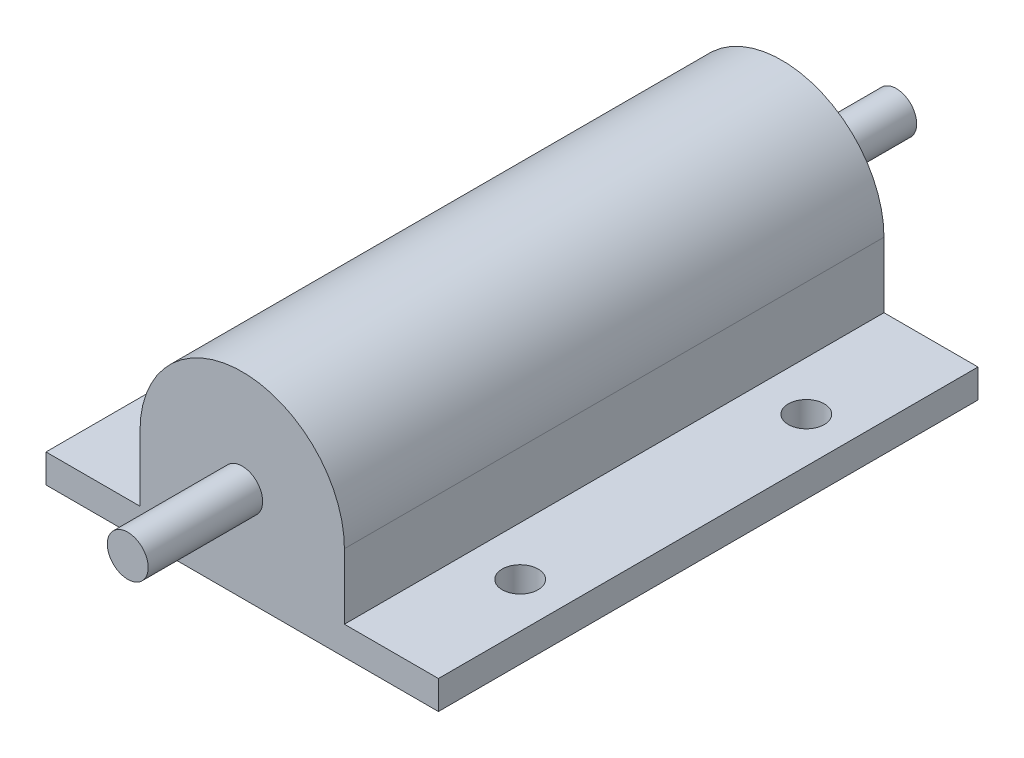
ISO-10303-21;
HEADER;
FILE_DESCRIPTION(('STEP AP214'),'2;1');
FILE_NAME('part.step','',(''),(''),'','','');
FILE_SCHEMA(('AUTOMOTIVE_DESIGN { 1 0 10303 214 1 1 1 1 }'));
ENDSEC;
DATA;
#1=APPLICATION_CONTEXT('core data for automotive mechanical design processes');
#2=APPLICATION_PROTOCOL_DEFINITION('international standard','automotive_design',2000,#1);
#3=PRODUCT_CONTEXT('',#1,'mechanical');
#4=PRODUCT('Part','Part','',(#3));
#5=PRODUCT_RELATED_PRODUCT_CATEGORY('part','',(#4));
#6=PRODUCT_DEFINITION_FORMATION('','',#4);
#7=PRODUCT_DEFINITION_CONTEXT('part definition',#1,'design');
#8=PRODUCT_DEFINITION('design','',#6,#7);
#9=PRODUCT_DEFINITION_SHAPE('','',#8);
#10=(LENGTH_UNIT() NAMED_UNIT(*) SI_UNIT(.MILLI.,.METRE.));
#11=(NAMED_UNIT(*) PLANE_ANGLE_UNIT() SI_UNIT($,.RADIAN.));
#12=(NAMED_UNIT(*) SI_UNIT($,.STERADIAN.) SOLID_ANGLE_UNIT());
#13=UNCERTAINTY_MEASURE_WITH_UNIT(LENGTH_MEASURE(1.E-05),#10,'distance_accuracy_value','');
#14=(GEOMETRIC_REPRESENTATION_CONTEXT(3) GLOBAL_UNCERTAINTY_ASSIGNED_CONTEXT((#13)) GLOBAL_UNIT_ASSIGNED_CONTEXT((#10,
#11,#12)) REPRESENTATION_CONTEXT('',''));
#15=CARTESIAN_POINT('',(0.,0.,0.));
#16=DIRECTION('',(0.,0.,1.));
#17=DIRECTION('',(1.,0.,0.));
#18=AXIS2_PLACEMENT_3D('',#15,#16,#17);
#19=CARTESIAN_POINT('',(-24.,-11.5,33.));
#20=DIRECTION('',(1.,0.,0.));
#21=DIRECTION('',(0.,0.,-1.));
#22=AXIS2_PLACEMENT_3D('',#19,#20,#21);
#23=PLANE('',#22);
#24=DIRECTION('',(0.,-1.,0.));
#25=VECTOR('',#24,1.);
#26=CARTESIAN_POINT('',(-24.,-11.5,-33.));
#27=LINE('',#26,#25);
#28=CARTESIAN_POINT('',(-24.,-8.,-33.));
#29=VERTEX_POINT('',#28);
#30=CARTESIAN_POINT('',(-24.,-11.5,-33.));
#31=VERTEX_POINT('',#30);
#32=EDGE_CURVE('E141',#29,#31,#27,.T.);
#33=ORIENTED_EDGE('',*,*,#32,.T.);
#34=DIRECTION('',(0.,0.,-1.));
#35=VECTOR('',#34,1.);
#36=CARTESIAN_POINT('',(-24.,-11.5,33.));
#37=LINE('',#36,#35);
#38=CARTESIAN_POINT('',(-24.,-11.5,33.));
#39=VERTEX_POINT('',#38);
#40=EDGE_CURVE('E52',#39,#31,#37,.T.);
#41=ORIENTED_EDGE('',*,*,#40,.F.);
#42=DIRECTION('',(0.,-1.,0.));
#43=VECTOR('',#42,1.);
#44=CARTESIAN_POINT('',(-24.,-11.5,33.));
#45=LINE('',#44,#43);
#46=CARTESIAN_POINT('',(-24.,-8.,33.));
#47=VERTEX_POINT('',#46);
#48=EDGE_CURVE('E156',#47,#39,#45,.T.);
#49=ORIENTED_EDGE('',*,*,#48,.F.);
#50=DIRECTION('',(0.,0.,-1.));
#51=VECTOR('',#50,1.);
#52=CARTESIAN_POINT('',(-24.,-8.,33.));
#53=LINE('',#52,#51);
#54=EDGE_CURVE('E137',#47,#29,#53,.T.);
#55=ORIENTED_EDGE('',*,*,#54,.T.);
#56=EDGE_LOOP('',(#33,#41,#49,#55));
#57=FACE_BOUND('',#56,.T.);
#58=ADVANCED_FACE('F44',(#57),#23,.F.);
#59=CARTESIAN_POINT('',(-24.,-11.5,33.));
#60=DIRECTION('',(0.,1.,0.));
#61=DIRECTION('',(0.,0.,1.));
#62=AXIS2_PLACEMENT_3D('',#59,#60,#61);
#63=PLANE('',#62);
#64=CARTESIAN_POINT('',(18.5,-11.5,-17.5));
#65=DIRECTION('',(0.,1.,0.));
#66=DIRECTION('',(0.,0.,1.));
#67=AXIS2_PLACEMENT_3D('',#64,#65,#66);
#68=CIRCLE('',#67,2.2);
#69=CARTESIAN_POINT('',(18.5,-11.5,-15.3));
#70=VERTEX_POINT('',#69);
#71=EDGE_CURVE('E199',#70,#70,#68,.T.);
#72=ORIENTED_EDGE('',*,*,#71,.T.);
#73=EDGE_LOOP('',(#72));
#74=FACE_BOUND('',#73,.T.);
#75=CARTESIAN_POINT('',(18.5,-11.5,17.5));
#76=DIRECTION('',(0.,1.,0.));
#77=DIRECTION('',(0.,0.,1.));
#78=AXIS2_PLACEMENT_3D('',#75,#76,#77);
#79=CIRCLE('',#78,2.2);
#80=CARTESIAN_POINT('',(18.5,-11.5,19.7));
#81=VERTEX_POINT('',#80);
#82=EDGE_CURVE('E206',#81,#81,#79,.T.);
#83=ORIENTED_EDGE('',*,*,#82,.T.);
#84=EDGE_LOOP('',(#83));
#85=FACE_BOUND('',#84,.T.);
#86=CARTESIAN_POINT('',(-18.5,-11.5,17.5));
#87=DIRECTION('',(0.,1.,0.));
#88=DIRECTION('',(0.,0.,1.));
#89=AXIS2_PLACEMENT_3D('',#86,#87,#88);
#90=CIRCLE('',#89,2.2);
#91=CARTESIAN_POINT('',(-18.5,-11.5,19.7));
#92=VERTEX_POINT('',#91);
#93=EDGE_CURVE('E212',#92,#92,#90,.T.);
#94=ORIENTED_EDGE('',*,*,#93,.T.);
#95=EDGE_LOOP('',(#94));
#96=FACE_BOUND('',#95,.T.);
#97=CARTESIAN_POINT('',(-18.5,-11.5,-17.5));
#98=DIRECTION('',(0.,1.,0.));
#99=DIRECTION('',(0.,0.,1.));
#100=AXIS2_PLACEMENT_3D('',#97,#98,#99);
#101=CIRCLE('',#100,2.2);
#102=CARTESIAN_POINT('',(-18.5,-11.5,-15.3));
#103=VERTEX_POINT('',#102);
#104=EDGE_CURVE('E145',#103,#103,#101,.T.);
#105=ORIENTED_EDGE('',*,*,#104,.T.);
#106=EDGE_LOOP('',(#105));
#107=FACE_BOUND('',#106,.T.);
#108=DIRECTION('',(1.,0.,0.));
#109=VECTOR('',#108,1.);
#110=CARTESIAN_POINT('',(-24.,-11.5,-33.));
#111=LINE('',#110,#109);
#112=CARTESIAN_POINT('',(24.,-11.5,-33.));
#113=VERTEX_POINT('',#112);
#114=EDGE_CURVE('E144',#31,#113,#111,.T.);
#115=ORIENTED_EDGE('',*,*,#114,.T.);
#116=DIRECTION('',(0.,0.,-1.));
#117=VECTOR('',#116,1.);
#118=CARTESIAN_POINT('',(24.,-11.5,33.));
#119=LINE('',#118,#117);
#120=CARTESIAN_POINT('',(24.,-11.5,33.));
#121=VERTEX_POINT('',#120);
#122=EDGE_CURVE('E166',#121,#113,#119,.T.);
#123=ORIENTED_EDGE('',*,*,#122,.F.);
#124=DIRECTION('',(1.,0.,0.));
#125=VECTOR('',#124,1.);
#126=CARTESIAN_POINT('',(-24.,-11.5,33.));
#127=LINE('',#126,#125);
#128=EDGE_CURVE('E104',#39,#121,#127,.T.);
#129=ORIENTED_EDGE('',*,*,#128,.F.);
#130=ORIENTED_EDGE('',*,*,#40,.T.);
#131=EDGE_LOOP('',(#115,#123,#129,#130));
#132=FACE_BOUND('',#131,.T.);
#133=ADVANCED_FACE('F169',(#74,#85,#96,#107,#132),#63,.F.);
#134=CARTESIAN_POINT('',(24.,-11.5,33.));
#135=DIRECTION('',(-1.,0.,0.));
#136=DIRECTION('',(0.,0.,1.));
#137=AXIS2_PLACEMENT_3D('',#134,#135,#136);
#138=PLANE('',#137);
#139=DIRECTION('',(0.,1.,0.));
#140=VECTOR('',#139,1.);
#141=CARTESIAN_POINT('',(24.,-11.5,-33.));
#142=LINE('',#141,#140);
#143=CARTESIAN_POINT('',(24.,-8.,-33.));
#144=VERTEX_POINT('',#143);
#145=EDGE_CURVE('E147',#113,#144,#142,.T.);
#146=ORIENTED_EDGE('',*,*,#145,.T.);
#147=DIRECTION('',(0.,0.,-1.));
#148=VECTOR('',#147,1.);
#149=CARTESIAN_POINT('',(24.,-8.,33.));
#150=LINE('',#149,#148);
#151=CARTESIAN_POINT('',(24.,-8.,33.));
#152=VERTEX_POINT('',#151);
#153=EDGE_CURVE('E163',#152,#144,#150,.T.);
#154=ORIENTED_EDGE('',*,*,#153,.F.);
#155=DIRECTION('',(0.,1.,0.));
#156=VECTOR('',#155,1.);
#157=CARTESIAN_POINT('',(24.,-11.5,33.));
#158=LINE('',#157,#156);
#159=EDGE_CURVE('E187',#121,#152,#158,.T.);
#160=ORIENTED_EDGE('',*,*,#159,.F.);
#161=ORIENTED_EDGE('',*,*,#122,.T.);
#162=EDGE_LOOP('',(#146,#154,#160,#161));
#163=FACE_BOUND('',#162,.T.);
#164=ADVANCED_FACE('F180',(#163),#138,.F.);
#165=CARTESIAN_POINT('',(12.5,-8.,33.));
#166=DIRECTION('',(0.,-1.,0.));
#167=DIRECTION('',(0.,0.,-1.));
#168=AXIS2_PLACEMENT_3D('',#165,#166,#167);
#169=PLANE('',#168);
#170=CARTESIAN_POINT('',(18.5,-8.,-17.5));
#171=DIRECTION('',(0.,1.,0.));
#172=DIRECTION('',(0.,0.,1.));
#173=AXIS2_PLACEMENT_3D('',#170,#171,#172);
#174=CIRCLE('',#173,2.2);
#175=CARTESIAN_POINT('',(18.5,-8.,-15.3));
#176=VERTEX_POINT('',#175);
#177=EDGE_CURVE('E202',#176,#176,#174,.T.);
#178=ORIENTED_EDGE('',*,*,#177,.F.);
#179=EDGE_LOOP('',(#178));
#180=FACE_BOUND('',#179,.T.);
#181=CARTESIAN_POINT('',(18.5,-8.,17.5));
#182=DIRECTION('',(0.,1.,0.));
#183=DIRECTION('',(0.,0.,1.));
#184=AXIS2_PLACEMENT_3D('',#181,#182,#183);
#185=CIRCLE('',#184,2.2);
#186=CARTESIAN_POINT('',(18.5,-8.,19.7));
#187=VERTEX_POINT('',#186);
#188=EDGE_CURVE('E209',#187,#187,#185,.T.);
#189=ORIENTED_EDGE('',*,*,#188,.F.);
#190=EDGE_LOOP('',(#189));
#191=FACE_BOUND('',#190,.T.);
#192=DIRECTION('',(-1.,0.,0.));
#193=VECTOR('',#192,1.);
#194=CARTESIAN_POINT('',(12.5,-8.,-33.));
#195=LINE('',#194,#193);
#196=CARTESIAN_POINT('',(12.5,-8.,-33.));
#197=VERTEX_POINT('',#196);
#198=EDGE_CURVE('E149',#144,#197,#195,.T.);
#199=ORIENTED_EDGE('',*,*,#198,.T.);
#200=DIRECTION('',(0.,0.,-1.));
#201=VECTOR('',#200,1.);
#202=CARTESIAN_POINT('',(12.5,-8.,33.));
#203=LINE('',#202,#201);
#204=CARTESIAN_POINT('',(12.5,-8.,33.));
#205=VERTEX_POINT('',#204);
#206=EDGE_CURVE('E160',#205,#197,#203,.T.);
#207=ORIENTED_EDGE('',*,*,#206,.F.);
#208=DIRECTION('',(-1.,0.,0.));
#209=VECTOR('',#208,1.);
#210=CARTESIAN_POINT('',(12.5,-8.,33.));
#211=LINE('',#210,#209);
#212=EDGE_CURVE('E186',#152,#205,#211,.T.);
#213=ORIENTED_EDGE('',*,*,#212,.F.);
#214=ORIENTED_EDGE('',*,*,#153,.T.);
#215=EDGE_LOOP('',(#199,#207,#213,#214));
#216=FACE_BOUND('',#215,.T.);
#217=ADVANCED_FACE('F184',(#180,#191,#216),#169,.F.);
#218=CARTESIAN_POINT('',(12.5,0.,33.));
#219=DIRECTION('',(-1.,0.,0.));
#220=DIRECTION('',(0.,0.,1.));
#221=AXIS2_PLACEMENT_3D('',#218,#219,#220);
#222=PLANE('',#221);
#223=DIRECTION('',(0.,1.,0.));
#224=VECTOR('',#223,1.);
#225=CARTESIAN_POINT('',(12.5,0.,-33.));
#226=LINE('',#225,#224);
#227=CARTESIAN_POINT('',(12.5,0.,-33.));
#228=VERTEX_POINT('',#227);
#229=EDGE_CURVE('E151',#197,#228,#226,.T.);
#230=ORIENTED_EDGE('',*,*,#229,.T.);
#231=DIRECTION('',(0.,0.,-1.));
#232=VECTOR('',#231,1.);
#233=CARTESIAN_POINT('',(12.5,0.,33.));
#234=LINE('',#233,#232);
#235=CARTESIAN_POINT('',(12.5,0.,33.));
#236=VERTEX_POINT('',#235);
#237=EDGE_CURVE('E132',#236,#228,#234,.T.);
#238=ORIENTED_EDGE('',*,*,#237,.F.);
#239=DIRECTION('',(0.,1.,0.));
#240=VECTOR('',#239,1.);
#241=CARTESIAN_POINT('',(12.5,0.,33.));
#242=LINE('',#241,#240);
#243=EDGE_CURVE('E123',#205,#236,#242,.T.);
#244=ORIENTED_EDGE('',*,*,#243,.F.);
#245=ORIENTED_EDGE('',*,*,#206,.T.);
#246=EDGE_LOOP('',(#230,#238,#244,#245));
#247=FACE_BOUND('',#246,.T.);
#248=ADVANCED_FACE('F250',(#247),#222,.F.);
#249=CARTESIAN_POINT('',(0.,0.,33.));
#250=DIRECTION('',(0.,0.,-1.));
#251=DIRECTION('',(-1.,0.,0.));
#252=AXIS2_PLACEMENT_3D('',#249,#250,#251);
#253=CYLINDRICAL_SURFACE('',#252,12.5);
#254=CARTESIAN_POINT('',(0.,0.,-33.));
#255=DIRECTION('',(0.,0.,1.));
#256=DIRECTION('',(1.,0.,0.));
#257=AXIS2_PLACEMENT_3D('',#254,#255,#256);
#258=CIRCLE('',#257,12.5);
#259=CARTESIAN_POINT('',(-12.5,0.,-33.));
#260=VERTEX_POINT('',#259);
#261=EDGE_CURVE('E131',#228,#260,#258,.T.);
#262=ORIENTED_EDGE('',*,*,#261,.T.);
#263=DIRECTION('',(0.,0.,-1.));
#264=VECTOR('',#263,1.);
#265=CARTESIAN_POINT('',(-12.5,0.,33.));
#266=LINE('',#265,#264);
#267=CARTESIAN_POINT('',(-12.5,0.,33.));
#268=VERTEX_POINT('',#267);
#269=EDGE_CURVE('E128',#268,#260,#266,.T.);
#270=ORIENTED_EDGE('',*,*,#269,.F.);
#271=CARTESIAN_POINT('',(0.,0.,33.));
#272=DIRECTION('',(0.,0.,1.));
#273=DIRECTION('',(1.,0.,0.));
#274=AXIS2_PLACEMENT_3D('',#271,#272,#273);
#275=CIRCLE('',#274,12.5);
#276=EDGE_CURVE('E117',#236,#268,#275,.T.);
#277=ORIENTED_EDGE('',*,*,#276,.F.);
#278=ORIENTED_EDGE('',*,*,#237,.T.);
#279=EDGE_LOOP('',(#262,#270,#277,#278));
#280=FACE_BOUND('',#279,.T.);
#281=ADVANCED_FACE('F129',(#280),#253,.T.);
#282=CARTESIAN_POINT('',(-12.5,0.,33.));
#283=DIRECTION('',(1.,0.,0.));
#284=DIRECTION('',(0.,0.,-1.));
#285=AXIS2_PLACEMENT_3D('',#282,#283,#284);
#286=PLANE('',#285);
#287=DIRECTION('',(0.,-1.,0.));
#288=VECTOR('',#287,1.);
#289=CARTESIAN_POINT('',(-12.5,0.,-33.));
#290=LINE('',#289,#288);
#291=CARTESIAN_POINT('',(-12.5,-8.,-33.));
#292=VERTEX_POINT('',#291);
#293=EDGE_CURVE('E89',#260,#292,#290,.T.);
#294=ORIENTED_EDGE('',*,*,#293,.T.);
#295=DIRECTION('',(0.,0.,-1.));
#296=VECTOR('',#295,1.);
#297=CARTESIAN_POINT('',(-12.5,-8.,33.));
#298=LINE('',#297,#296);
#299=CARTESIAN_POINT('',(-12.5,-8.,33.));
#300=VERTEX_POINT('',#299);
#301=EDGE_CURVE('E133',#300,#292,#298,.T.);
#302=ORIENTED_EDGE('',*,*,#301,.F.);
#303=DIRECTION('',(0.,-1.,0.));
#304=VECTOR('',#303,1.);
#305=CARTESIAN_POINT('',(-12.5,0.,33.));
#306=LINE('',#305,#304);
#307=EDGE_CURVE('E121',#268,#300,#306,.T.);
#308=ORIENTED_EDGE('',*,*,#307,.F.);
#309=ORIENTED_EDGE('',*,*,#269,.T.);
#310=EDGE_LOOP('',(#294,#302,#308,#309));
#311=FACE_BOUND('',#310,.T.);
#312=ADVANCED_FACE('F135',(#311),#286,.F.);
#313=CARTESIAN_POINT('',(-24.,-8.,33.));
#314=DIRECTION('',(0.,-1.,0.));
#315=DIRECTION('',(0.,0.,-1.));
#316=AXIS2_PLACEMENT_3D('',#313,#314,#315);
#317=PLANE('',#316);
#318=CARTESIAN_POINT('',(-18.5,-8.,17.5));
#319=DIRECTION('',(0.,1.,0.));
#320=DIRECTION('',(0.,0.,1.));
#321=AXIS2_PLACEMENT_3D('',#318,#319,#320);
#322=CIRCLE('',#321,2.2);
#323=CARTESIAN_POINT('',(-18.5,-8.,19.7));
#324=VERTEX_POINT('',#323);
#325=EDGE_CURVE('E196',#324,#324,#322,.T.);
#326=ORIENTED_EDGE('',*,*,#325,.F.);
#327=EDGE_LOOP('',(#326));
#328=FACE_BOUND('',#327,.T.);
#329=CARTESIAN_POINT('',(-18.5,-8.,-17.5));
#330=DIRECTION('',(0.,1.,0.));
#331=DIRECTION('',(0.,0.,1.));
#332=AXIS2_PLACEMENT_3D('',#329,#330,#331);
#333=CIRCLE('',#332,2.2);
#334=CARTESIAN_POINT('',(-18.5,-8.,-15.3));
#335=VERTEX_POINT('',#334);
#336=EDGE_CURVE('E193',#335,#335,#333,.T.);
#337=ORIENTED_EDGE('',*,*,#336,.F.);
#338=EDGE_LOOP('',(#337));
#339=FACE_BOUND('',#338,.T.);
#340=DIRECTION('',(-1.,0.,0.));
#341=VECTOR('',#340,1.);
#342=CARTESIAN_POINT('',(-24.,-8.,-33.));
#343=LINE('',#342,#341);
#344=EDGE_CURVE('E95',#292,#29,#343,.T.);
#345=ORIENTED_EDGE('',*,*,#344,.T.);
#346=ORIENTED_EDGE('',*,*,#54,.F.);
#347=DIRECTION('',(-1.,0.,0.));
#348=VECTOR('',#347,1.);
#349=CARTESIAN_POINT('',(-24.,-8.,33.));
#350=LINE('',#349,#348);
#351=EDGE_CURVE('E60',#300,#47,#350,.T.);
#352=ORIENTED_EDGE('',*,*,#351,.F.);
#353=ORIENTED_EDGE('',*,*,#301,.T.);
#354=EDGE_LOOP('',(#345,#346,#352,#353));
#355=FACE_BOUND('',#354,.T.);
#356=ADVANCED_FACE('F259',(#328,#339,#355),#317,.F.);
#357=CARTESIAN_POINT('',(0.,0.,33.));
#358=DIRECTION('',(0.,0.,1.));
#359=DIRECTION('',(1.,0.,0.));
#360=AXIS2_PLACEMENT_3D('',#357,#358,#359);
#361=PLANE('',#360);
#362=CARTESIAN_POINT('',(0.,0.,33.));
#363=DIRECTION('',(0.,0.,1.));
#364=DIRECTION('',(1.,0.,0.));
#365=AXIS2_PLACEMENT_3D('',#362,#363,#364);
#366=CIRCLE('',#365,2.5);
#367=CARTESIAN_POINT('',(2.5,0.,33.));
#368=VERTEX_POINT('',#367);
#369=EDGE_CURVE('E219',#368,#368,#366,.T.);
#370=ORIENTED_EDGE('',*,*,#369,.F.);
#371=EDGE_LOOP('',(#370));
#372=FACE_BOUND('',#371,.T.);
#373=ORIENTED_EDGE('',*,*,#48,.T.);
#374=ORIENTED_EDGE('',*,*,#128,.T.);
#375=ORIENTED_EDGE('',*,*,#159,.T.);
#376=ORIENTED_EDGE('',*,*,#212,.T.);
#377=ORIENTED_EDGE('',*,*,#243,.T.);
#378=ORIENTED_EDGE('',*,*,#276,.T.);
#379=ORIENTED_EDGE('',*,*,#307,.T.);
#380=ORIENTED_EDGE('',*,*,#351,.T.);
#381=EDGE_LOOP('',(#373,#374,#375,#376,#377,#378,#379,#380));
#382=FACE_BOUND('',#381,.T.);
#383=ADVANCED_FACE('F119',(#372,#382),#361,.T.);
#384=CARTESIAN_POINT('',(0.,0.,-33.));
#385=DIRECTION('',(0.,0.,1.));
#386=DIRECTION('',(1.,0.,0.));
#387=AXIS2_PLACEMENT_3D('',#384,#385,#386);
#388=PLANE('',#387);
#389=CARTESIAN_POINT('',(0.,0.,-33.));
#390=DIRECTION('',(0.,0.,1.));
#391=DIRECTION('',(1.,0.,0.));
#392=AXIS2_PLACEMENT_3D('',#389,#390,#391);
#393=CIRCLE('',#392,2.5);
#394=CARTESIAN_POINT('',(2.5,0.,-33.));
#395=VERTEX_POINT('',#394);
#396=EDGE_CURVE('E12',#395,#395,#393,.F.);
#397=ORIENTED_EDGE('',*,*,#396,.F.);
#398=EDGE_LOOP('',(#397));
#399=FACE_BOUND('',#398,.T.);
#400=ORIENTED_EDGE('',*,*,#32,.F.);
#401=ORIENTED_EDGE('',*,*,#344,.F.);
#402=ORIENTED_EDGE('',*,*,#293,.F.);
#403=ORIENTED_EDGE('',*,*,#261,.F.);
#404=ORIENTED_EDGE('',*,*,#229,.F.);
#405=ORIENTED_EDGE('',*,*,#198,.F.);
#406=ORIENTED_EDGE('',*,*,#145,.F.);
#407=ORIENTED_EDGE('',*,*,#114,.F.);
#408=EDGE_LOOP('',(#400,#401,#402,#403,#404,#405,#406,#407));
#409=FACE_BOUND('',#408,.T.);
#410=ADVANCED_FACE('F174',(#399,#409),#388,.F.);
#411=CARTESIAN_POINT('',(-18.5,-11.5,-17.5));
#412=DIRECTION('',(0.,1.,0.));
#413=DIRECTION('',(0.,0.,1.));
#414=AXIS2_PLACEMENT_3D('',#411,#412,#413);
#415=CYLINDRICAL_SURFACE('',#414,2.2);
#416=CARTESIAN_POINT('',(-18.5,-11.5,-15.3));
#417=CARTESIAN_POINT('',(-18.5,-11.4635416666667,-15.3));
#418=CARTESIAN_POINT('',(-18.5,-11.4270833333333,-15.3));
#419=CARTESIAN_POINT('',(-18.5,-11.3541666666667,-15.3));
#420=CARTESIAN_POINT('',(-18.5,-11.3177083333333,-15.3));
#421=CARTESIAN_POINT('',(-18.5,-11.2447916666667,-15.3));
#422=CARTESIAN_POINT('',(-18.5,-11.2083333333333,-15.3));
#423=CARTESIAN_POINT('',(-18.5,-11.1354166666667,-15.3));
#424=CARTESIAN_POINT('',(-18.5,-11.0989583333333,-15.3));
#425=CARTESIAN_POINT('',(-18.5,-11.0260416666667,-15.3));
#426=CARTESIAN_POINT('',(-18.5,-10.9895833333333,-15.3));
#427=CARTESIAN_POINT('',(-18.5,-10.9166666666667,-15.3));
#428=CARTESIAN_POINT('',(-18.5,-10.8802083333333,-15.3));
#429=CARTESIAN_POINT('',(-18.5,-10.8072916666667,-15.3));
#430=CARTESIAN_POINT('',(-18.5,-10.7708333333333,-15.3));
#431=CARTESIAN_POINT('',(-18.5,-10.6979166666667,-15.3));
#432=CARTESIAN_POINT('',(-18.5,-10.6614583333333,-15.3));
#433=CARTESIAN_POINT('',(-18.5,-10.5885416666667,-15.3));
#434=CARTESIAN_POINT('',(-18.5,-10.5520833333333,-15.3));
#435=CARTESIAN_POINT('',(-18.5,-10.4791666666667,-15.3));
#436=CARTESIAN_POINT('',(-18.5,-10.4427083333333,-15.3));
#437=CARTESIAN_POINT('',(-18.5,-10.3697916666667,-15.3));
#438=CARTESIAN_POINT('',(-18.5,-10.3333333333333,-15.3));
#439=CARTESIAN_POINT('',(-18.5,-10.2604166666667,-15.3));
#440=CARTESIAN_POINT('',(-18.5,-10.2239583333333,-15.3));
#441=CARTESIAN_POINT('',(-18.5,-10.1510416666667,-15.3));
#442=CARTESIAN_POINT('',(-18.5,-10.1145833333333,-15.3));
#443=CARTESIAN_POINT('',(-18.5,-10.0416666666667,-15.3));
#444=CARTESIAN_POINT('',(-18.5,-10.0052083333333,-15.3));
#445=CARTESIAN_POINT('',(-18.5,-9.93229166666667,-15.3));
#446=CARTESIAN_POINT('',(-18.5,-9.89583333333333,-15.3));
#447=CARTESIAN_POINT('',(-18.5,-9.82291666666667,-15.3));
#448=CARTESIAN_POINT('',(-18.5,-9.78645833333333,-15.3));
#449=CARTESIAN_POINT('',(-18.5,-9.71354166666667,-15.3));
#450=CARTESIAN_POINT('',(-18.5,-9.67708333333333,-15.3));
#451=CARTESIAN_POINT('',(-18.5,-9.60416666666667,-15.3));
#452=CARTESIAN_POINT('',(-18.5,-9.56770833333333,-15.3));
#453=CARTESIAN_POINT('',(-18.5,-9.49479166666667,-15.3));
#454=CARTESIAN_POINT('',(-18.5,-9.45833333333333,-15.3));
#455=CARTESIAN_POINT('',(-18.5,-9.38541666666667,-15.3));
#456=CARTESIAN_POINT('',(-18.5,-9.34895833333333,-15.3));
#457=CARTESIAN_POINT('',(-18.5,-9.27604166666667,-15.3));
#458=CARTESIAN_POINT('',(-18.5,-9.23958333333333,-15.3));
#459=CARTESIAN_POINT('',(-18.5,-9.16666666666667,-15.3));
#460=CARTESIAN_POINT('',(-18.5,-9.13020833333333,-15.3));
#461=CARTESIAN_POINT('',(-18.5,-9.05729166666667,-15.3));
#462=CARTESIAN_POINT('',(-18.5,-9.02083333333333,-15.3));
#463=CARTESIAN_POINT('',(-18.5,-8.94791666666667,-15.3));
#464=CARTESIAN_POINT('',(-18.5,-8.91145833333333,-15.3));
#465=CARTESIAN_POINT('',(-18.5,-8.83854166666667,-15.3));
#466=CARTESIAN_POINT('',(-18.5,-8.80208333333333,-15.3));
#467=CARTESIAN_POINT('',(-18.5,-8.72916666666667,-15.3));
#468=CARTESIAN_POINT('',(-18.5,-8.69270833333333,-15.3));
#469=CARTESIAN_POINT('',(-18.5,-8.61979166666667,-15.3));
#470=CARTESIAN_POINT('',(-18.5,-8.58333333333334,-15.3));
#471=CARTESIAN_POINT('',(-18.5,-8.51041666666667,-15.3));
#472=CARTESIAN_POINT('',(-18.5,-8.47395833333334,-15.3));
#473=CARTESIAN_POINT('',(-18.5,-8.40104166666667,-15.3));
#474=CARTESIAN_POINT('',(-18.5,-8.36458333333334,-15.3));
#475=CARTESIAN_POINT('',(-18.5,-8.29166666666667,-15.3));
#476=CARTESIAN_POINT('',(-18.5,-8.25520833333334,-15.3));
#477=CARTESIAN_POINT('',(-18.5,-8.18229166666667,-15.3));
#478=CARTESIAN_POINT('',(-18.5,-8.14583333333333,-15.3));
#479=CARTESIAN_POINT('',(-18.5,-8.07291666666667,-15.3));
#480=CARTESIAN_POINT('',(-18.5,-8.03645833333333,-15.3));
#481=CARTESIAN_POINT('',(-18.5,-8.,-15.3));
#482=B_SPLINE_CURVE_WITH_KNOTS('',3,(#416,#417,#418,#419,#420,#421,#422,#423,#424,#425,#426,
#427,#428,#429,#430,#431,#432,#433,#434,#435,#436,#437,#438,#439,#440,#441,#442,#443,#444,#445,
#446,#447,#448,#449,#450,#451,#452,#453,#454,#455,#456,#457,#458,#459,#460,#461,#462,#463,#464,
#465,#466,#467,#468,#469,#470,#471,#472,#473,#474,#475,#476,#477,#478,#479,#480,#481),
.UNSPECIFIED.,.F.,.F.,(4,2,2,2,2,2,2,2,2,2,2,2,2,2,2,2,2,2,2,2,2,2,2,2,2,2,2,2,2,2,2,2,4),(0.,
0.109374999999998,0.218749999999998,0.328124999999999,0.437499999999999,0.546874999999999,
0.656249999999999,0.765624999999999,0.874999999999999,0.984374999999999,1.09375,1.203125,1.3125,
1.421875,1.53125,1.640625,1.75,1.859375,1.96875,2.078125,2.1875,2.296875,2.40625,2.515625,2.625,
2.734375,2.84375,2.953125,3.0625,3.171875,3.28125,3.390625,3.5),.UNSPECIFIED.);
#483=EDGE_CURVE('BSEAM265',#103,#335,#482,.T.);
#484=ORIENTED_EDGE('',*,*,#104,.F.);
#485=ORIENTED_EDGE('',*,*,#336,.T.);
#486=ORIENTED_EDGE('',*,*,#483,.T.);
#487=ORIENTED_EDGE('',*,*,#483,.F.);
#488=EDGE_LOOP('',(#484,#486,#485,#487));
#489=FACE_BOUND('',#488,.T.);
#490=ADVANCED_FACE('F265',(#489),#415,.F.);
#491=CARTESIAN_POINT('',(-18.5,-11.5,17.5));
#492=DIRECTION('',(0.,1.,0.));
#493=DIRECTION('',(0.,0.,1.));
#494=AXIS2_PLACEMENT_3D('',#491,#492,#493);
#495=CYLINDRICAL_SURFACE('',#494,2.2);
#496=CARTESIAN_POINT('',(-18.5,-11.5,19.7));
#497=CARTESIAN_POINT('',(-18.5,-11.4635416666667,19.7));
#498=CARTESIAN_POINT('',(-18.5,-11.4270833333333,19.7));
#499=CARTESIAN_POINT('',(-18.5,-11.3541666666667,19.7));
#500=CARTESIAN_POINT('',(-18.5,-11.3177083333333,19.7));
#501=CARTESIAN_POINT('',(-18.5,-11.2447916666667,19.7));
#502=CARTESIAN_POINT('',(-18.5,-11.2083333333333,19.7));
#503=CARTESIAN_POINT('',(-18.5,-11.1354166666667,19.7));
#504=CARTESIAN_POINT('',(-18.5,-11.0989583333333,19.7));
#505=CARTESIAN_POINT('',(-18.5,-11.0260416666667,19.7));
#506=CARTESIAN_POINT('',(-18.5,-10.9895833333333,19.7));
#507=CARTESIAN_POINT('',(-18.5,-10.9166666666667,19.7));
#508=CARTESIAN_POINT('',(-18.5,-10.8802083333333,19.7));
#509=CARTESIAN_POINT('',(-18.5,-10.8072916666667,19.7));
#510=CARTESIAN_POINT('',(-18.5,-10.7708333333333,19.7));
#511=CARTESIAN_POINT('',(-18.5,-10.6979166666667,19.7));
#512=CARTESIAN_POINT('',(-18.5,-10.6614583333333,19.7));
#513=CARTESIAN_POINT('',(-18.5,-10.5885416666667,19.7));
#514=CARTESIAN_POINT('',(-18.5,-10.5520833333333,19.7));
#515=CARTESIAN_POINT('',(-18.5,-10.4791666666667,19.7));
#516=CARTESIAN_POINT('',(-18.5,-10.4427083333333,19.7));
#517=CARTESIAN_POINT('',(-18.5,-10.3697916666667,19.7));
#518=CARTESIAN_POINT('',(-18.5,-10.3333333333333,19.7));
#519=CARTESIAN_POINT('',(-18.5,-10.2604166666667,19.7));
#520=CARTESIAN_POINT('',(-18.5,-10.2239583333333,19.7));
#521=CARTESIAN_POINT('',(-18.5,-10.1510416666667,19.7));
#522=CARTESIAN_POINT('',(-18.5,-10.1145833333333,19.7));
#523=CARTESIAN_POINT('',(-18.5,-10.0416666666667,19.7));
#524=CARTESIAN_POINT('',(-18.5,-10.0052083333333,19.7));
#525=CARTESIAN_POINT('',(-18.5,-9.93229166666667,19.7));
#526=CARTESIAN_POINT('',(-18.5,-9.89583333333333,19.7));
#527=CARTESIAN_POINT('',(-18.5,-9.82291666666667,19.7));
#528=CARTESIAN_POINT('',(-18.5,-9.78645833333333,19.7));
#529=CARTESIAN_POINT('',(-18.5,-9.71354166666667,19.7));
#530=CARTESIAN_POINT('',(-18.5,-9.67708333333333,19.7));
#531=CARTESIAN_POINT('',(-18.5,-9.60416666666667,19.7));
#532=CARTESIAN_POINT('',(-18.5,-9.56770833333333,19.7));
#533=CARTESIAN_POINT('',(-18.5,-9.49479166666667,19.7));
#534=CARTESIAN_POINT('',(-18.5,-9.45833333333333,19.7));
#535=CARTESIAN_POINT('',(-18.5,-9.38541666666667,19.7));
#536=CARTESIAN_POINT('',(-18.5,-9.34895833333333,19.7));
#537=CARTESIAN_POINT('',(-18.5,-9.27604166666667,19.7));
#538=CARTESIAN_POINT('',(-18.5,-9.23958333333333,19.7));
#539=CARTESIAN_POINT('',(-18.5,-9.16666666666667,19.7));
#540=CARTESIAN_POINT('',(-18.5,-9.13020833333333,19.7));
#541=CARTESIAN_POINT('',(-18.5,-9.05729166666667,19.7));
#542=CARTESIAN_POINT('',(-18.5,-9.02083333333333,19.7));
#543=CARTESIAN_POINT('',(-18.5,-8.94791666666667,19.7));
#544=CARTESIAN_POINT('',(-18.5,-8.91145833333333,19.7));
#545=CARTESIAN_POINT('',(-18.5,-8.83854166666667,19.7));
#546=CARTESIAN_POINT('',(-18.5,-8.80208333333333,19.7));
#547=CARTESIAN_POINT('',(-18.5,-8.72916666666667,19.7));
#548=CARTESIAN_POINT('',(-18.5,-8.69270833333333,19.7));
#549=CARTESIAN_POINT('',(-18.5,-8.61979166666667,19.7));
#550=CARTESIAN_POINT('',(-18.5,-8.58333333333334,19.7));
#551=CARTESIAN_POINT('',(-18.5,-8.51041666666667,19.7));
#552=CARTESIAN_POINT('',(-18.5,-8.47395833333334,19.7));
#553=CARTESIAN_POINT('',(-18.5,-8.40104166666667,19.7));
#554=CARTESIAN_POINT('',(-18.5,-8.36458333333334,19.7));
#555=CARTESIAN_POINT('',(-18.5,-8.29166666666667,19.7));
#556=CARTESIAN_POINT('',(-18.5,-8.25520833333334,19.7));
#557=CARTESIAN_POINT('',(-18.5,-8.18229166666667,19.7));
#558=CARTESIAN_POINT('',(-18.5,-8.14583333333333,19.7));
#559=CARTESIAN_POINT('',(-18.5,-8.07291666666667,19.7));
#560=CARTESIAN_POINT('',(-18.5,-8.03645833333333,19.7));
#561=CARTESIAN_POINT('',(-18.5,-8.,19.7));
#562=B_SPLINE_CURVE_WITH_KNOTS('',3,(#496,#497,#498,#499,#500,#501,#502,#503,#504,#505,#506,
#507,#508,#509,#510,#511,#512,#513,#514,#515,#516,#517,#518,#519,#520,#521,#522,#523,#524,#525,
#526,#527,#528,#529,#530,#531,#532,#533,#534,#535,#536,#537,#538,#539,#540,#541,#542,#543,#544,
#545,#546,#547,#548,#549,#550,#551,#552,#553,#554,#555,#556,#557,#558,#559,#560,#561),
.UNSPECIFIED.,.F.,.F.,(4,2,2,2,2,2,2,2,2,2,2,2,2,2,2,2,2,2,2,2,2,2,2,2,2,2,2,2,2,2,2,2,4),(0.,
0.109374999999998,0.218749999999998,0.328124999999999,0.437499999999999,0.546874999999999,
0.656249999999999,0.765624999999999,0.874999999999999,0.984374999999999,1.09375,1.203125,1.3125,
1.421875,1.53125,1.640625,1.75,1.859375,1.96875,2.078125,2.1875,2.296875,2.40625,2.515625,2.625,
2.734375,2.84375,2.953125,3.0625,3.171875,3.28125,3.390625,3.5),.UNSPECIFIED.);
#563=EDGE_CURVE('BSEAM272',#92,#324,#562,.T.);
#564=ORIENTED_EDGE('',*,*,#93,.F.);
#565=ORIENTED_EDGE('',*,*,#325,.T.);
#566=ORIENTED_EDGE('',*,*,#563,.T.);
#567=ORIENTED_EDGE('',*,*,#563,.F.);
#568=EDGE_LOOP('',(#564,#566,#565,#567));
#569=FACE_BOUND('',#568,.T.);
#570=ADVANCED_FACE('F272',(#569),#495,.F.);
#571=CARTESIAN_POINT('',(18.5,-11.5,17.5));
#572=DIRECTION('',(0.,1.,0.));
#573=DIRECTION('',(0.,0.,1.));
#574=AXIS2_PLACEMENT_3D('',#571,#572,#573);
#575=CYLINDRICAL_SURFACE('',#574,2.2);
#576=CARTESIAN_POINT('',(18.5,-11.5,19.7));
#577=CARTESIAN_POINT('',(18.5,-11.4635416666667,19.7));
#578=CARTESIAN_POINT('',(18.5,-11.4270833333333,19.7));
#579=CARTESIAN_POINT('',(18.5,-11.3541666666667,19.7));
#580=CARTESIAN_POINT('',(18.5,-11.3177083333333,19.7));
#581=CARTESIAN_POINT('',(18.5,-11.2447916666667,19.7));
#582=CARTESIAN_POINT('',(18.5,-11.2083333333333,19.7));
#583=CARTESIAN_POINT('',(18.5,-11.1354166666667,19.7));
#584=CARTESIAN_POINT('',(18.5,-11.0989583333333,19.7));
#585=CARTESIAN_POINT('',(18.5,-11.0260416666667,19.7));
#586=CARTESIAN_POINT('',(18.5,-10.9895833333333,19.7));
#587=CARTESIAN_POINT('',(18.5,-10.9166666666667,19.7));
#588=CARTESIAN_POINT('',(18.5,-10.8802083333333,19.7));
#589=CARTESIAN_POINT('',(18.5,-10.8072916666667,19.7));
#590=CARTESIAN_POINT('',(18.5,-10.7708333333333,19.7));
#591=CARTESIAN_POINT('',(18.5,-10.6979166666667,19.7));
#592=CARTESIAN_POINT('',(18.5,-10.6614583333333,19.7));
#593=CARTESIAN_POINT('',(18.5,-10.5885416666667,19.7));
#594=CARTESIAN_POINT('',(18.5,-10.5520833333333,19.7));
#595=CARTESIAN_POINT('',(18.5,-10.4791666666667,19.7));
#596=CARTESIAN_POINT('',(18.5,-10.4427083333333,19.7));
#597=CARTESIAN_POINT('',(18.5,-10.3697916666667,19.7));
#598=CARTESIAN_POINT('',(18.5,-10.3333333333333,19.7));
#599=CARTESIAN_POINT('',(18.5,-10.2604166666667,19.7));
#600=CARTESIAN_POINT('',(18.5,-10.2239583333333,19.7));
#601=CARTESIAN_POINT('',(18.5,-10.1510416666667,19.7));
#602=CARTESIAN_POINT('',(18.5,-10.1145833333333,19.7));
#603=CARTESIAN_POINT('',(18.5,-10.0416666666667,19.7));
#604=CARTESIAN_POINT('',(18.5,-10.0052083333333,19.7));
#605=CARTESIAN_POINT('',(18.5,-9.93229166666667,19.7));
#606=CARTESIAN_POINT('',(18.5,-9.89583333333333,19.7));
#607=CARTESIAN_POINT('',(18.5,-9.82291666666667,19.7));
#608=CARTESIAN_POINT('',(18.5,-9.78645833333333,19.7));
#609=CARTESIAN_POINT('',(18.5,-9.71354166666667,19.7));
#610=CARTESIAN_POINT('',(18.5,-9.67708333333333,19.7));
#611=CARTESIAN_POINT('',(18.5,-9.60416666666667,19.7));
#612=CARTESIAN_POINT('',(18.5,-9.56770833333333,19.7));
#613=CARTESIAN_POINT('',(18.5,-9.49479166666667,19.7));
#614=CARTESIAN_POINT('',(18.5,-9.45833333333333,19.7));
#615=CARTESIAN_POINT('',(18.5,-9.38541666666667,19.7));
#616=CARTESIAN_POINT('',(18.5,-9.34895833333333,19.7));
#617=CARTESIAN_POINT('',(18.5,-9.27604166666667,19.7));
#618=CARTESIAN_POINT('',(18.5,-9.23958333333333,19.7));
#619=CARTESIAN_POINT('',(18.5,-9.16666666666667,19.7));
#620=CARTESIAN_POINT('',(18.5,-9.13020833333333,19.7));
#621=CARTESIAN_POINT('',(18.5,-9.05729166666667,19.7));
#622=CARTESIAN_POINT('',(18.5,-9.02083333333333,19.7));
#623=CARTESIAN_POINT('',(18.5,-8.94791666666667,19.7));
#624=CARTESIAN_POINT('',(18.5,-8.91145833333333,19.7));
#625=CARTESIAN_POINT('',(18.5,-8.83854166666667,19.7));
#626=CARTESIAN_POINT('',(18.5,-8.80208333333333,19.7));
#627=CARTESIAN_POINT('',(18.5,-8.72916666666667,19.7));
#628=CARTESIAN_POINT('',(18.5,-8.69270833333333,19.7));
#629=CARTESIAN_POINT('',(18.5,-8.61979166666667,19.7));
#630=CARTESIAN_POINT('',(18.5,-8.58333333333334,19.7));
#631=CARTESIAN_POINT('',(18.5,-8.51041666666667,19.7));
#632=CARTESIAN_POINT('',(18.5,-8.47395833333334,19.7));
#633=CARTESIAN_POINT('',(18.5,-8.40104166666667,19.7));
#634=CARTESIAN_POINT('',(18.5,-8.36458333333334,19.7));
#635=CARTESIAN_POINT('',(18.5,-8.29166666666667,19.7));
#636=CARTESIAN_POINT('',(18.5,-8.25520833333334,19.7));
#637=CARTESIAN_POINT('',(18.5,-8.18229166666667,19.7));
#638=CARTESIAN_POINT('',(18.5,-8.14583333333333,19.7));
#639=CARTESIAN_POINT('',(18.5,-8.07291666666667,19.7));
#640=CARTESIAN_POINT('',(18.5,-8.03645833333333,19.7));
#641=CARTESIAN_POINT('',(18.5,-8.,19.7));
#642=B_SPLINE_CURVE_WITH_KNOTS('',3,(#576,#577,#578,#579,#580,#581,#582,#583,#584,#585,#586,
#587,#588,#589,#590,#591,#592,#593,#594,#595,#596,#597,#598,#599,#600,#601,#602,#603,#604,#605,
#606,#607,#608,#609,#610,#611,#612,#613,#614,#615,#616,#617,#618,#619,#620,#621,#622,#623,#624,
#625,#626,#627,#628,#629,#630,#631,#632,#633,#634,#635,#636,#637,#638,#639,#640,#641),
.UNSPECIFIED.,.F.,.F.,(4,2,2,2,2,2,2,2,2,2,2,2,2,2,2,2,2,2,2,2,2,2,2,2,2,2,2,2,2,2,2,2,4),(0.,
0.109374999999998,0.218749999999998,0.328124999999999,0.437499999999999,0.546874999999999,
0.656249999999999,0.765624999999999,0.874999999999999,0.984374999999999,1.09375,1.203125,1.3125,
1.421875,1.53125,1.640625,1.75,1.859375,1.96875,2.078125,2.1875,2.296875,2.40625,2.515625,2.625,
2.734375,2.84375,2.953125,3.0625,3.171875,3.28125,3.390625,3.5),.UNSPECIFIED.);
#643=EDGE_CURVE('BSEAM278',#81,#187,#642,.T.);
#644=ORIENTED_EDGE('',*,*,#82,.F.);
#645=ORIENTED_EDGE('',*,*,#188,.T.);
#646=ORIENTED_EDGE('',*,*,#643,.T.);
#647=ORIENTED_EDGE('',*,*,#643,.F.);
#648=EDGE_LOOP('',(#644,#646,#645,#647));
#649=FACE_BOUND('',#648,.T.);
#650=ADVANCED_FACE('F278',(#649),#575,.F.);
#651=CARTESIAN_POINT('',(18.5,-11.5,-17.5));
#652=DIRECTION('',(0.,1.,0.));
#653=DIRECTION('',(0.,0.,1.));
#654=AXIS2_PLACEMENT_3D('',#651,#652,#653);
#655=CYLINDRICAL_SURFACE('',#654,2.2);
#656=CARTESIAN_POINT('',(18.5,-11.5,-15.3));
#657=CARTESIAN_POINT('',(18.5,-11.4635416666667,-15.3));
#658=CARTESIAN_POINT('',(18.5,-11.4270833333333,-15.3));
#659=CARTESIAN_POINT('',(18.5,-11.3541666666667,-15.3));
#660=CARTESIAN_POINT('',(18.5,-11.3177083333333,-15.3));
#661=CARTESIAN_POINT('',(18.5,-11.2447916666667,-15.3));
#662=CARTESIAN_POINT('',(18.5,-11.2083333333333,-15.3));
#663=CARTESIAN_POINT('',(18.5,-11.1354166666667,-15.3));
#664=CARTESIAN_POINT('',(18.5,-11.0989583333333,-15.3));
#665=CARTESIAN_POINT('',(18.5,-11.0260416666667,-15.3));
#666=CARTESIAN_POINT('',(18.5,-10.9895833333333,-15.3));
#667=CARTESIAN_POINT('',(18.5,-10.9166666666667,-15.3));
#668=CARTESIAN_POINT('',(18.5,-10.8802083333333,-15.3));
#669=CARTESIAN_POINT('',(18.5,-10.8072916666667,-15.3));
#670=CARTESIAN_POINT('',(18.5,-10.7708333333333,-15.3));
#671=CARTESIAN_POINT('',(18.5,-10.6979166666667,-15.3));
#672=CARTESIAN_POINT('',(18.5,-10.6614583333333,-15.3));
#673=CARTESIAN_POINT('',(18.5,-10.5885416666667,-15.3));
#674=CARTESIAN_POINT('',(18.5,-10.5520833333333,-15.3));
#675=CARTESIAN_POINT('',(18.5,-10.4791666666667,-15.3));
#676=CARTESIAN_POINT('',(18.5,-10.4427083333333,-15.3));
#677=CARTESIAN_POINT('',(18.5,-10.3697916666667,-15.3));
#678=CARTESIAN_POINT('',(18.5,-10.3333333333333,-15.3));
#679=CARTESIAN_POINT('',(18.5,-10.2604166666667,-15.3));
#680=CARTESIAN_POINT('',(18.5,-10.2239583333333,-15.3));
#681=CARTESIAN_POINT('',(18.5,-10.1510416666667,-15.3));
#682=CARTESIAN_POINT('',(18.5,-10.1145833333333,-15.3));
#683=CARTESIAN_POINT('',(18.5,-10.0416666666667,-15.3));
#684=CARTESIAN_POINT('',(18.5,-10.0052083333333,-15.3));
#685=CARTESIAN_POINT('',(18.5,-9.93229166666667,-15.3));
#686=CARTESIAN_POINT('',(18.5,-9.89583333333333,-15.3));
#687=CARTESIAN_POINT('',(18.5,-9.82291666666667,-15.3));
#688=CARTESIAN_POINT('',(18.5,-9.78645833333333,-15.3));
#689=CARTESIAN_POINT('',(18.5,-9.71354166666667,-15.3));
#690=CARTESIAN_POINT('',(18.5,-9.67708333333333,-15.3));
#691=CARTESIAN_POINT('',(18.5,-9.60416666666667,-15.3));
#692=CARTESIAN_POINT('',(18.5,-9.56770833333333,-15.3));
#693=CARTESIAN_POINT('',(18.5,-9.49479166666667,-15.3));
#694=CARTESIAN_POINT('',(18.5,-9.45833333333333,-15.3));
#695=CARTESIAN_POINT('',(18.5,-9.38541666666667,-15.3));
#696=CARTESIAN_POINT('',(18.5,-9.34895833333333,-15.3));
#697=CARTESIAN_POINT('',(18.5,-9.27604166666667,-15.3));
#698=CARTESIAN_POINT('',(18.5,-9.23958333333333,-15.3));
#699=CARTESIAN_POINT('',(18.5,-9.16666666666667,-15.3));
#700=CARTESIAN_POINT('',(18.5,-9.13020833333333,-15.3));
#701=CARTESIAN_POINT('',(18.5,-9.05729166666667,-15.3));
#702=CARTESIAN_POINT('',(18.5,-9.02083333333333,-15.3));
#703=CARTESIAN_POINT('',(18.5,-8.94791666666667,-15.3));
#704=CARTESIAN_POINT('',(18.5,-8.91145833333333,-15.3));
#705=CARTESIAN_POINT('',(18.5,-8.83854166666667,-15.3));
#706=CARTESIAN_POINT('',(18.5,-8.80208333333333,-15.3));
#707=CARTESIAN_POINT('',(18.5,-8.72916666666667,-15.3));
#708=CARTESIAN_POINT('',(18.5,-8.69270833333333,-15.3));
#709=CARTESIAN_POINT('',(18.5,-8.61979166666667,-15.3));
#710=CARTESIAN_POINT('',(18.5,-8.58333333333334,-15.3));
#711=CARTESIAN_POINT('',(18.5,-8.51041666666667,-15.3));
#712=CARTESIAN_POINT('',(18.5,-8.47395833333334,-15.3));
#713=CARTESIAN_POINT('',(18.5,-8.40104166666667,-15.3));
#714=CARTESIAN_POINT('',(18.5,-8.36458333333334,-15.3));
#715=CARTESIAN_POINT('',(18.5,-8.29166666666667,-15.3));
#716=CARTESIAN_POINT('',(18.5,-8.25520833333334,-15.3));
#717=CARTESIAN_POINT('',(18.5,-8.18229166666667,-15.3));
#718=CARTESIAN_POINT('',(18.5,-8.14583333333333,-15.3));
#719=CARTESIAN_POINT('',(18.5,-8.07291666666667,-15.3));
#720=CARTESIAN_POINT('',(18.5,-8.03645833333333,-15.3));
#721=CARTESIAN_POINT('',(18.5,-8.,-15.3));
#722=B_SPLINE_CURVE_WITH_KNOTS('',3,(#656,#657,#658,#659,#660,#661,#662,#663,#664,#665,#666,
#667,#668,#669,#670,#671,#672,#673,#674,#675,#676,#677,#678,#679,#680,#681,#682,#683,#684,#685,
#686,#687,#688,#689,#690,#691,#692,#693,#694,#695,#696,#697,#698,#699,#700,#701,#702,#703,#704,
#705,#706,#707,#708,#709,#710,#711,#712,#713,#714,#715,#716,#717,#718,#719,#720,#721),
.UNSPECIFIED.,.F.,.F.,(4,2,2,2,2,2,2,2,2,2,2,2,2,2,2,2,2,2,2,2,2,2,2,2,2,2,2,2,2,2,2,2,4),(0.,
0.109374999999998,0.218749999999998,0.328124999999999,0.437499999999999,0.546874999999999,
0.656249999999999,0.765624999999999,0.874999999999999,0.984374999999999,1.09375,1.203125,1.3125,
1.421875,1.53125,1.640625,1.75,1.859375,1.96875,2.078125,2.1875,2.296875,2.40625,2.515625,2.625,
2.734375,2.84375,2.953125,3.0625,3.171875,3.28125,3.390625,3.5),.UNSPECIFIED.);
#723=EDGE_CURVE('BSEAM274',#70,#176,#722,.T.);
#724=ORIENTED_EDGE('',*,*,#71,.F.);
#725=ORIENTED_EDGE('',*,*,#177,.T.);
#726=ORIENTED_EDGE('',*,*,#723,.T.);
#727=ORIENTED_EDGE('',*,*,#723,.F.);
#728=EDGE_LOOP('',(#724,#726,#725,#727));
#729=FACE_BOUND('',#728,.T.);
#730=ADVANCED_FACE('F274',(#729),#655,.F.);
#731=CARTESIAN_POINT('',(0.,0.,101.071067811865));
#732=DIRECTION('',(0.,0.,-1.));
#733=DIRECTION('',(-1.,0.,0.));
#734=AXIS2_PLACEMENT_3D('',#731,#732,#733);
#735=CYLINDRICAL_SURFACE('',#734,2.5);
#736=ORIENTED_EDGE('',*,*,#369,.T.);
#737=EDGE_LOOP('',(#736));
#738=FACE_BOUND('',#737,.T.);
#739=CARTESIAN_POINT('',(0.,0.,47.));
#740=DIRECTION('',(0.,0.,1.));
#741=DIRECTION('',(1.,0.,0.));
#742=AXIS2_PLACEMENT_3D('',#739,#740,#741);
#743=CIRCLE('',#742,2.5);
#744=CARTESIAN_POINT('',(2.5,0.,47.));
#745=VERTEX_POINT('',#744);
#746=EDGE_CURVE('E203',#745,#745,#743,.T.);
#747=ORIENTED_EDGE('',*,*,#746,.F.);
#748=EDGE_LOOP('',(#747));
#749=FACE_BOUND('',#748,.T.);
#750=ADVANCED_FACE('F277',(#738,#749),#735,.T.);
#751=CARTESIAN_POINT('',(0.,0.,47.));
#752=DIRECTION('',(0.,0.,1.));
#753=DIRECTION('',(1.,0.,0.));
#754=AXIS2_PLACEMENT_3D('',#751,#752,#753);
#755=PLANE('',#754);
#756=ORIENTED_EDGE('',*,*,#746,.T.);
#757=EDGE_LOOP('',(#756));
#758=FACE_BOUND('',#757,.T.);
#759=ADVANCED_FACE('F234',(#758),#755,.T.);
#760=CARTESIAN_POINT('',(0.,0.,-101.071067811865));
#761=DIRECTION('',(0.,0.,1.));
#762=DIRECTION('',(-1.,0.,0.));
#763=AXIS2_PLACEMENT_3D('',#760,#761,#762);
#764=CYLINDRICAL_SURFACE('',#763,2.5);
#765=ORIENTED_EDGE('',*,*,#396,.T.);
#766=EDGE_LOOP('',(#765));
#767=FACE_BOUND('',#766,.T.);
#768=CARTESIAN_POINT('',(0.,0.,-47.));
#769=DIRECTION('',(0.,0.,1.));
#770=DIRECTION('',(1.,0.,0.));
#771=AXIS2_PLACEMENT_3D('',#768,#769,#770);
#772=CIRCLE('',#771,2.5);
#773=CARTESIAN_POINT('',(2.5,0.,-47.));
#774=VERTEX_POINT('',#773);
#775=EDGE_CURVE('E222',#774,#774,#772,.T.);
#776=ORIENTED_EDGE('',*,*,#775,.T.);
#777=EDGE_LOOP('',(#776));
#778=FACE_BOUND('',#777,.T.);
#779=ADVANCED_FACE('F226',(#767,#778),#764,.T.);
#780=CARTESIAN_POINT('',(0.,0.,-47.));
#781=DIRECTION('',(0.,0.,-1.));
#782=DIRECTION('',(1.,0.,0.));
#783=AXIS2_PLACEMENT_3D('',#780,#781,#782);
#784=PLANE('',#783);
#785=ORIENTED_EDGE('',*,*,#775,.F.);
#786=EDGE_LOOP('',(#785));
#787=FACE_BOUND('',#786,.T.);
#788=ADVANCED_FACE('F228',(#787),#784,.T.);
#789=CLOSED_SHELL('',(#58,#133,#164,#217,#248,#281,#312,#356,#383,#410,#490,#570,#650,#730,#750,
#759,#779,#788));
#790=MANIFOLD_SOLID_BREP('B2',#789);
#791=ADVANCED_BREP_SHAPE_REPRESENTATION('',(#18,#790),#14);
#792=SHAPE_DEFINITION_REPRESENTATION(#9,#791);
ENDSEC;
END-ISO-10303-21;
